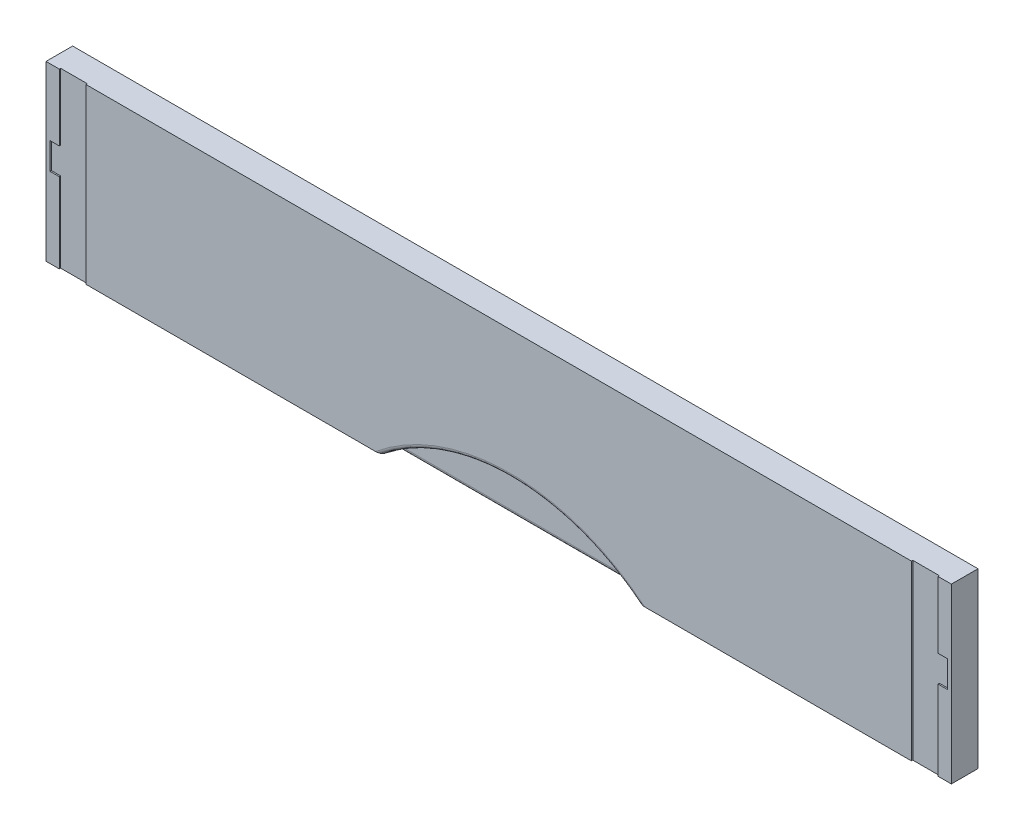
ISO-10303-21;
HEADER;
FILE_DESCRIPTION(('STEP AP214'),'2;1');
FILE_NAME('part.step','',(''),(''),'','','');
FILE_SCHEMA(('AUTOMOTIVE_DESIGN { 1 0 10303 214 1 1 1 1 }'));
ENDSEC;
DATA;
#1=APPLICATION_CONTEXT('core data for automotive mechanical design processes');
#2=APPLICATION_PROTOCOL_DEFINITION('international standard','automotive_design',2000,#1);
#3=PRODUCT_CONTEXT('',#1,'mechanical');
#4=PRODUCT('Part','Part','',(#3));
#5=PRODUCT_RELATED_PRODUCT_CATEGORY('part','',(#4));
#6=PRODUCT_DEFINITION_FORMATION('','',#4);
#7=PRODUCT_DEFINITION_CONTEXT('part definition',#1,'design');
#8=PRODUCT_DEFINITION('design','',#6,#7);
#9=PRODUCT_DEFINITION_SHAPE('','',#8);
#10=(LENGTH_UNIT() NAMED_UNIT(*) SI_UNIT(.MILLI.,.METRE.));
#11=(NAMED_UNIT(*) PLANE_ANGLE_UNIT() SI_UNIT($,.RADIAN.));
#12=(NAMED_UNIT(*) SI_UNIT($,.STERADIAN.) SOLID_ANGLE_UNIT());
#13=UNCERTAINTY_MEASURE_WITH_UNIT(LENGTH_MEASURE(1.E-05),#10,'distance_accuracy_value','');
#14=(GEOMETRIC_REPRESENTATION_CONTEXT(3) GLOBAL_UNCERTAINTY_ASSIGNED_CONTEXT((#13)) GLOBAL_UNIT_ASSIGNED_CONTEXT((#10,
#11,#12)) REPRESENTATION_CONTEXT('',''));
#15=CARTESIAN_POINT('',(0.,0.,0.));
#16=DIRECTION('',(0.,0.,1.));
#17=DIRECTION('',(1.,0.,0.));
#18=AXIS2_PLACEMENT_3D('',#15,#16,#17);
#19=CARTESIAN_POINT('',(0.,0.,20.));
#20=DIRECTION('',(0.,0.,-1.));
#21=DIRECTION('',(-1.,0.,0.));
#22=AXIS2_PLACEMENT_3D('',#19,#20,#21);
#23=PLANE('',#22);
#24=DIRECTION('',(-1.,0.,0.));
#25=VECTOR('',#24,1.);
#26=CARTESIAN_POINT('',(-340.,65.,20.));
#27=LINE('',#26,#25);
#28=CARTESIAN_POINT('',(310.,65.,20.));
#29=VERTEX_POINT('',#28);
#30=CARTESIAN_POINT('',(-310.,65.,20.));
#31=VERTEX_POINT('',#30);
#32=EDGE_CURVE('E310',#29,#31,#27,.T.);
#33=ORIENTED_EDGE('',*,*,#32,.T.);
#34=DIRECTION('',(0.,1.,0.));
#35=VECTOR('',#34,1.);
#36=CARTESIAN_POINT('',(-310.,65.,20.));
#37=LINE('',#36,#35);
#38=CARTESIAN_POINT('',(-310.,-65.,20.));
#39=VERTEX_POINT('',#38);
#40=EDGE_CURVE('E221',#39,#31,#37,.T.);
#41=ORIENTED_EDGE('',*,*,#40,.F.);
#42=DIRECTION('',(1.,0.,0.));
#43=VECTOR('',#42,1.);
#44=CARTESIAN_POINT('',(-340.,-65.,20.));
#45=LINE('',#44,#43);
#46=CARTESIAN_POINT('',(-92.4592539622144,-65.,20.));
#47=VERTEX_POINT('',#46);
#48=EDGE_CURVE('E317',#39,#47,#45,.T.);
#49=ORIENTED_EDGE('',*,*,#48,.T.);
#50=CARTESIAN_POINT('',(8.63075935572433,-187.032244742536,20.));
#51=DIRECTION('',(0.,0.,-1.));
#52=DIRECTION('',(-1.,0.,0.));
#53=AXIS2_PLACEMENT_3D('',#50,#51,#52);
#54=CIRCLE('',#53,158.46469496239);
#55=CARTESIAN_POINT('',(109.720772673663,-65.,20.));
#56=VERTEX_POINT('',#55);
#57=EDGE_CURVE('E455',#47,#56,#54,.T.);
#58=ORIENTED_EDGE('',*,*,#57,.T.);
#59=CARTESIAN_POINT('',(310.,-65.,20.));
#60=VERTEX_POINT('',#59);
#61=EDGE_CURVE('E318',#56,#60,#45,.T.);
#62=ORIENTED_EDGE('',*,*,#61,.T.);
#63=DIRECTION('',(0.,-1.,0.));
#64=VECTOR('',#63,1.);
#65=CARTESIAN_POINT('',(310.,65.,20.));
#66=LINE('',#65,#64);
#67=EDGE_CURVE('E259',#29,#60,#66,.T.);
#68=ORIENTED_EDGE('',*,*,#67,.F.);
#69=EDGE_LOOP('',(#33,#41,#49,#58,#62,#68));
#70=FACE_BOUND('',#69,.T.);
#71=ADVANCED_FACE('F39',(#70),#23,.F.);
#72=CARTESIAN_POINT('',(340.,65.,20.));
#73=VERTEX_POINT('',#72);
#74=CARTESIAN_POINT('',(330.,65.,20.));
#75=VERTEX_POINT('',#74);
#76=EDGE_CURVE('E306',#73,#75,#27,.T.);
#77=ORIENTED_EDGE('',*,*,#76,.T.);
#78=DIRECTION('',(0.,1.,0.));
#79=VECTOR('',#78,1.);
#80=CARTESIAN_POINT('',(330.,15.,20.));
#81=LINE('',#80,#79);
#82=CARTESIAN_POINT('',(330.,15.,20.));
#83=VERTEX_POINT('',#82);
#84=EDGE_CURVE('E238',#83,#75,#81,.T.);
#85=ORIENTED_EDGE('',*,*,#84,.F.);
#86=DIRECTION('',(-1.,0.,0.));
#87=VECTOR('',#86,1.);
#88=CARTESIAN_POINT('',(337.,15.,20.));
#89=LINE('',#88,#87);
#90=CARTESIAN_POINT('',(337.,15.,20.));
#91=VERTEX_POINT('',#90);
#92=EDGE_CURVE('E271',#91,#83,#89,.T.);
#93=ORIENTED_EDGE('',*,*,#92,.F.);
#94=DIRECTION('',(0.,1.,0.));
#95=VECTOR('',#94,1.);
#96=CARTESIAN_POINT('',(337.,-5.,20.));
#97=LINE('',#96,#95);
#98=CARTESIAN_POINT('',(337.,-5.,20.));
#99=VERTEX_POINT('',#98);
#100=EDGE_CURVE('E268',#99,#91,#97,.T.);
#101=ORIENTED_EDGE('',*,*,#100,.F.);
#102=DIRECTION('',(1.,0.,0.));
#103=VECTOR('',#102,1.);
#104=CARTESIAN_POINT('',(330.,-5.,20.));
#105=LINE('',#104,#103);
#106=CARTESIAN_POINT('',(330.,-5.,20.));
#107=VERTEX_POINT('',#106);
#108=EDGE_CURVE('E265',#107,#99,#105,.T.);
#109=ORIENTED_EDGE('',*,*,#108,.F.);
#110=DIRECTION('',(0.,1.,0.));
#111=VECTOR('',#110,1.);
#112=CARTESIAN_POINT('',(330.,-65.,20.));
#113=LINE('',#112,#111);
#114=CARTESIAN_POINT('',(330.,-65.,20.));
#115=VERTEX_POINT('',#114);
#116=EDGE_CURVE('E261',#115,#107,#113,.T.);
#117=ORIENTED_EDGE('',*,*,#116,.F.);
#118=CARTESIAN_POINT('',(340.,-65.,20.));
#119=VERTEX_POINT('',#118);
#120=EDGE_CURVE('E312',#115,#119,#45,.T.);
#121=ORIENTED_EDGE('',*,*,#120,.T.);
#122=DIRECTION('',(0.,1.,0.));
#123=VECTOR('',#122,1.);
#124=CARTESIAN_POINT('',(340.,-65.,20.));
#125=LINE('',#124,#123);
#126=EDGE_CURVE('E302',#119,#73,#125,.T.);
#127=ORIENTED_EDGE('',*,*,#126,.T.);
#128=EDGE_LOOP('',(#77,#85,#93,#101,#109,#117,#121,#127));
#129=FACE_BOUND('',#128,.T.);
#130=ADVANCED_FACE('F373',(#129),#23,.F.);
#131=CARTESIAN_POINT('',(340.,-65.,20.));
#132=DIRECTION('',(-1.,0.,0.));
#133=DIRECTION('',(0.,0.,1.));
#134=AXIS2_PLACEMENT_3D('',#131,#132,#133);
#135=PLANE('',#134);
#136=DIRECTION('',(0.,1.,0.));
#137=VECTOR('',#136,1.);
#138=CARTESIAN_POINT('',(340.,-65.,0.));
#139=LINE('',#138,#137);
#140=CARTESIAN_POINT('',(340.,-65.,0.));
#141=VERTEX_POINT('',#140);
#142=CARTESIAN_POINT('',(340.,65.,0.));
#143=VERTEX_POINT('',#142);
#144=EDGE_CURVE('E299',#141,#143,#139,.T.);
#145=ORIENTED_EDGE('',*,*,#144,.T.);
#146=DIRECTION('',(0.,0.,-1.));
#147=VECTOR('',#146,1.);
#148=CARTESIAN_POINT('',(340.,65.,20.));
#149=LINE('',#148,#147);
#150=EDGE_CURVE('E334',#73,#143,#149,.T.);
#151=ORIENTED_EDGE('',*,*,#150,.F.);
#152=ORIENTED_EDGE('',*,*,#126,.F.);
#153=DIRECTION('',(0.,0.,-1.));
#154=VECTOR('',#153,1.);
#155=CARTESIAN_POINT('',(340.,-65.,20.));
#156=LINE('',#155,#154);
#157=EDGE_CURVE('E316',#119,#141,#156,.T.);
#158=ORIENTED_EDGE('',*,*,#157,.T.);
#159=EDGE_LOOP('',(#145,#151,#152,#158));
#160=FACE_BOUND('',#159,.T.);
#161=ADVANCED_FACE('F371',(#160),#135,.F.);
#162=CARTESIAN_POINT('',(-340.,65.,20.));
#163=DIRECTION('',(0.,-1.,0.));
#164=DIRECTION('',(0.,0.,-1.));
#165=AXIS2_PLACEMENT_3D('',#162,#163,#164);
#166=PLANE('',#165);
#167=DIRECTION('',(-1.,0.,0.));
#168=VECTOR('',#167,1.);
#169=CARTESIAN_POINT('',(-330.,65.,19.));
#170=LINE('',#169,#168);
#171=CARTESIAN_POINT('',(-310.,65.,19.));
#172=VERTEX_POINT('',#171);
#173=CARTESIAN_POINT('',(-330.,65.,19.));
#174=VERTEX_POINT('',#173);
#175=EDGE_CURVE('E212',#172,#174,#170,.T.);
#176=ORIENTED_EDGE('',*,*,#175,.F.);
#177=DIRECTION('',(0.,0.,1.));
#178=VECTOR('',#177,1.);
#179=CARTESIAN_POINT('',(-310.,65.,19.));
#180=LINE('',#179,#178);
#181=EDGE_CURVE('E262',#172,#31,#180,.T.);
#182=ORIENTED_EDGE('',*,*,#181,.T.);
#183=ORIENTED_EDGE('',*,*,#32,.F.);
#184=DIRECTION('',(0.,0.,1.));
#185=VECTOR('',#184,1.);
#186=CARTESIAN_POINT('',(310.,65.,19.));
#187=LINE('',#186,#185);
#188=CARTESIAN_POINT('',(310.,65.,19.));
#189=VERTEX_POINT('',#188);
#190=EDGE_CURVE('E68',#189,#29,#187,.T.);
#191=ORIENTED_EDGE('',*,*,#190,.F.);
#192=DIRECTION('',(-1.,0.,0.));
#193=VECTOR('',#192,1.);
#194=CARTESIAN_POINT('',(330.,65.,19.));
#195=LINE('',#194,#193);
#196=CARTESIAN_POINT('',(330.,65.,19.));
#197=VERTEX_POINT('',#196);
#198=EDGE_CURVE('E234',#197,#189,#195,.T.);
#199=ORIENTED_EDGE('',*,*,#198,.F.);
#200=DIRECTION('',(0.,0.,1.));
#201=VECTOR('',#200,1.);
#202=CARTESIAN_POINT('',(330.,65.,19.));
#203=LINE('',#202,#201);
#204=EDGE_CURVE('E275',#197,#75,#203,.T.);
#205=ORIENTED_EDGE('',*,*,#204,.T.);
#206=ORIENTED_EDGE('',*,*,#76,.F.);
#207=ORIENTED_EDGE('',*,*,#150,.T.);
#208=DIRECTION('',(-1.,0.,0.));
#209=VECTOR('',#208,1.);
#210=CARTESIAN_POINT('',(-340.,65.,0.));
#211=LINE('',#210,#209);
#212=CARTESIAN_POINT('',(-340.,65.,0.));
#213=VERTEX_POINT('',#212);
#214=EDGE_CURVE('E321',#143,#213,#211,.T.);
#215=ORIENTED_EDGE('',*,*,#214,.T.);
#216=DIRECTION('',(0.,0.,-1.));
#217=VECTOR('',#216,1.);
#218=CARTESIAN_POINT('',(-340.,65.,20.));
#219=LINE('',#218,#217);
#220=CARTESIAN_POINT('',(-340.,65.,20.));
#221=VERTEX_POINT('',#220);
#222=EDGE_CURVE('E331',#221,#213,#219,.T.);
#223=ORIENTED_EDGE('',*,*,#222,.F.);
#224=CARTESIAN_POINT('',(-330.,65.,20.));
#225=VERTEX_POINT('',#224);
#226=EDGE_CURVE('E226',#225,#221,#27,.T.);
#227=ORIENTED_EDGE('',*,*,#226,.F.);
#228=DIRECTION('',(0.,0.,1.));
#229=VECTOR('',#228,1.);
#230=CARTESIAN_POINT('',(-330.,65.,19.));
#231=LINE('',#230,#229);
#232=EDGE_CURVE('E60',#174,#225,#231,.T.);
#233=ORIENTED_EDGE('',*,*,#232,.F.);
#234=EDGE_LOOP('',(#176,#182,#183,#191,#199,#205,#206,#207,#215,#223,#227,#233));
#235=FACE_BOUND('',#234,.T.);
#236=ADVANCED_FACE('F224',(#235),#166,.F.);
#237=CARTESIAN_POINT('',(-340.,-65.,20.));
#238=DIRECTION('',(1.,0.,0.));
#239=DIRECTION('',(0.,0.,-1.));
#240=AXIS2_PLACEMENT_3D('',#237,#238,#239);
#241=PLANE('',#240);
#242=DIRECTION('',(0.,-1.,0.));
#243=VECTOR('',#242,1.);
#244=CARTESIAN_POINT('',(-340.,-65.,0.));
#245=LINE('',#244,#243);
#246=CARTESIAN_POINT('',(-340.,-65.,0.));
#247=VERTEX_POINT('',#246);
#248=EDGE_CURVE('E323',#213,#247,#245,.T.);
#249=ORIENTED_EDGE('',*,*,#248,.T.);
#250=DIRECTION('',(0.,0.,-1.));
#251=VECTOR('',#250,1.);
#252=CARTESIAN_POINT('',(-340.,-65.,20.));
#253=LINE('',#252,#251);
#254=CARTESIAN_POINT('',(-340.,-65.,20.));
#255=VERTEX_POINT('',#254);
#256=EDGE_CURVE('E328',#255,#247,#253,.T.);
#257=ORIENTED_EDGE('',*,*,#256,.F.);
#258=DIRECTION('',(0.,-1.,0.));
#259=VECTOR('',#258,1.);
#260=CARTESIAN_POINT('',(-340.,-65.,20.));
#261=LINE('',#260,#259);
#262=EDGE_CURVE('E309',#221,#255,#261,.T.);
#263=ORIENTED_EDGE('',*,*,#262,.F.);
#264=ORIENTED_EDGE('',*,*,#222,.T.);
#265=EDGE_LOOP('',(#249,#257,#263,#264));
#266=FACE_BOUND('',#265,.T.);
#267=ADVANCED_FACE('F362',(#266),#241,.F.);
#268=CARTESIAN_POINT('',(-340.,-65.,20.));
#269=DIRECTION('',(0.,1.,0.));
#270=DIRECTION('',(0.,0.,1.));
#271=AXIS2_PLACEMENT_3D('',#268,#269,#270);
#272=PLANE('',#271);
#273=ORIENTED_EDGE('',*,*,#48,.F.);
#274=DIRECTION('',(0.,0.,1.));
#275=VECTOR('',#274,1.);
#276=CARTESIAN_POINT('',(-310.,-65.,19.));
#277=LINE('',#276,#275);
#278=CARTESIAN_POINT('',(-310.,-65.,19.));
#279=VERTEX_POINT('',#278);
#280=EDGE_CURVE('E409',#279,#39,#277,.T.);
#281=ORIENTED_EDGE('',*,*,#280,.F.);
#282=DIRECTION('',(1.,0.,0.));
#283=VECTOR('',#282,1.);
#284=CARTESIAN_POINT('',(-310.,-65.,19.));
#285=LINE('',#284,#283);
#286=CARTESIAN_POINT('',(-330.,-65.,19.));
#287=VERTEX_POINT('',#286);
#288=EDGE_CURVE('E230',#287,#279,#285,.T.);
#289=ORIENTED_EDGE('',*,*,#288,.F.);
#290=DIRECTION('',(0.,0.,1.));
#291=VECTOR('',#290,1.);
#292=CARTESIAN_POINT('',(-330.,-65.,19.));
#293=LINE('',#292,#291);
#294=CARTESIAN_POINT('',(-330.,-65.,20.));
#295=VERTEX_POINT('',#294);
#296=EDGE_CURVE('E404',#287,#295,#293,.T.);
#297=ORIENTED_EDGE('',*,*,#296,.T.);
#298=EDGE_CURVE('E313',#255,#295,#45,.T.);
#299=ORIENTED_EDGE('',*,*,#298,.F.);
#300=ORIENTED_EDGE('',*,*,#256,.T.);
#301=DIRECTION('',(1.,0.,0.));
#302=VECTOR('',#301,1.);
#303=CARTESIAN_POINT('',(-340.,-65.,0.));
#304=LINE('',#303,#302);
#305=EDGE_CURVE('E305',#247,#141,#304,.T.);
#306=ORIENTED_EDGE('',*,*,#305,.T.);
#307=ORIENTED_EDGE('',*,*,#157,.F.);
#308=ORIENTED_EDGE('',*,*,#120,.F.);
#309=DIRECTION('',(0.,0.,1.));
#310=VECTOR('',#309,1.);
#311=CARTESIAN_POINT('',(330.,-65.,19.));
#312=LINE('',#311,#310);
#313=CARTESIAN_POINT('',(330.,-65.,19.));
#314=VERTEX_POINT('',#313);
#315=EDGE_CURVE('E287',#314,#115,#312,.T.);
#316=ORIENTED_EDGE('',*,*,#315,.F.);
#317=DIRECTION('',(1.,0.,0.));
#318=VECTOR('',#317,1.);
#319=CARTESIAN_POINT('',(310.,-65.,19.));
#320=LINE('',#319,#318);
#321=CARTESIAN_POINT('',(310.,-65.,19.));
#322=VERTEX_POINT('',#321);
#323=EDGE_CURVE('E241',#322,#314,#320,.T.);
#324=ORIENTED_EDGE('',*,*,#323,.F.);
#325=DIRECTION('',(0.,0.,1.));
#326=VECTOR('',#325,1.);
#327=CARTESIAN_POINT('',(310.,-65.,19.));
#328=LINE('',#327,#326);
#329=EDGE_CURVE('E289',#322,#60,#328,.T.);
#330=ORIENTED_EDGE('',*,*,#329,.T.);
#331=ORIENTED_EDGE('',*,*,#61,.F.);
#332=CARTESIAN_POINT('',(109.720772673663,-65.,20.));
#333=CARTESIAN_POINT('',(109.619638134241,-65.,19.9999959708007));
#334=CARTESIAN_POINT('',(109.518515268347,-65.,19.9979190582826));
#335=CARTESIAN_POINT('',(109.316436296389,-65.,19.9896115971215));
#336=CARTESIAN_POINT('',(109.21548019723,-65.,19.9833808806212));
#337=CARTESIAN_POINT('',(108.912709970433,-65.,19.9584151798617));
#338=CARTESIAN_POINT('',(108.7113757984,-65.,19.9334065713925));
#339=CARTESIAN_POINT('',(108.309234729398,-65.,19.8658891992966));
#340=CARTESIAN_POINT('',(108.108461385276,-65.,19.8231796792793));
#341=CARTESIAN_POINT('',(107.711913587767,-65.,19.7194308799956));
#342=CARTESIAN_POINT('',(107.516134139548,-65.,19.6584107627146));
#343=CARTESIAN_POINT('',(107.107259751486,-65.,19.5075603085166));
#344=CARTESIAN_POINT('',(106.895117625716,-65.,19.4150576722885));
#345=CARTESIAN_POINT('',(106.588141525679,-65.,19.2554694898936));
#346=CARTESIAN_POINT('',(106.48779717791,-65.,19.1988775032565));
#347=CARTESIAN_POINT('',(106.291696330802,-65.,19.0782582487996));
#348=CARTESIAN_POINT('',(106.195938560601,-65.,19.0142330576274));
#349=CARTESIAN_POINT('',(105.966448261059,-65.,18.8462358311108));
#350=CARTESIAN_POINT('',(105.836029844684,-65.,18.7376355839505));
#351=CARTESIAN_POINT('',(105.593100872655,-65.,18.5018060040853));
#352=CARTESIAN_POINT('',(105.480567975577,-65.,18.3746002998542));
#353=CARTESIAN_POINT('',(105.308010382867,-65.,18.1379475252494));
#354=CARTESIAN_POINT('',(105.241998823797,-65.,18.032895385284));
#355=CARTESIAN_POINT('',(105.12777728567,-65.,17.8137075588186));
#356=CARTESIAN_POINT('',(105.07951528055,-65.,17.6995996308519));
#357=CARTESIAN_POINT('',(105.012134945688,-65.,17.4883787774659));
#358=CARTESIAN_POINT('',(104.98908483487,-65.,17.3925318477876));
#359=CARTESIAN_POINT('',(104.965780234847,-65.,17.246695228132));
#360=CARTESIAN_POINT('',(104.95988985444,-65.,17.1975649917819));
#361=CARTESIAN_POINT('',(104.952011528759,-65.,17.0989630794299));
#362=CARTESIAN_POINT('',(104.950025973868,-65.,17.0494912128767));
#363=CARTESIAN_POINT('',(104.950033765609,-65.,17.));
#364=B_SPLINE_CURVE_WITH_KNOTS('',3,(#332,#333,#334,#335,#336,#337,#338,#339,#340,#341,#342,
#343,#344,#345,#346,#347,#348,#349,#350,#351,#352,#353,#354,#355,#356,#357,#358,#359,#360,#361,
#362,#363),.UNSPECIFIED.,.F.,.F.,(4,2,2,2,2,2,2,2,2,2,2,2,2,2,2,4),(0.,0.303358922625846,
0.606730104884305,1.21461461690777,1.82959082251887,2.44392568858284,3.13617017365452,
3.48150482345366,3.82674322668199,4.33430574583517,4.84122918161469,5.21211812849285,
5.58191112393388,5.87646364463283,6.02477005732852,6.17316722921338),.UNSPECIFIED.);
#365=CARTESIAN_POINT('',(104.950033765609,-65.,17.));
#366=VERTEX_POINT('',#365);
#367=EDGE_CURVE('E340',#56,#366,#364,.T.);
#368=ORIENTED_EDGE('',*,*,#367,.T.);
#369=DIRECTION('',(0.,0.,1.));
#370=VECTOR('',#369,1.);
#371=CARTESIAN_POINT('',(104.950033765609,-65.,10.));
#372=LINE('',#371,#370);
#373=CARTESIAN_POINT('',(104.950033765609,-65.,7.));
#374=VERTEX_POINT('',#373);
#375=EDGE_CURVE('E296',#374,#366,#372,.T.);
#376=ORIENTED_EDGE('',*,*,#375,.F.);
#377=DIRECTION('',(1.,0.,0.));
#378=VECTOR('',#377,1.);
#379=CARTESIAN_POINT('',(-340.,-65.,7.));
#380=LINE('',#379,#378);
#381=CARTESIAN_POINT('',(-87.6885150541605,-65.,7.));
#382=VERTEX_POINT('',#381);
#383=EDGE_CURVE('E463',#374,#382,#380,.F.);
#384=ORIENTED_EDGE('',*,*,#383,.T.);
#385=DIRECTION('',(0.,0.,1.));
#386=VECTOR('',#385,1.);
#387=CARTESIAN_POINT('',(-87.6885150541605,-65.,10.));
#388=LINE('',#387,#386);
#389=CARTESIAN_POINT('',(-87.6885150541605,-65.,17.));
#390=VERTEX_POINT('',#389);
#391=EDGE_CURVE('E295',#382,#390,#388,.T.);
#392=ORIENTED_EDGE('',*,*,#391,.T.);
#393=CARTESIAN_POINT('',(-87.6885150541605,-65.,17.));
#394=CARTESIAN_POINT('',(-87.6884844117382,-65.,17.0628249356231));
#395=CARTESIAN_POINT('',(-87.6916992178091,-65.,17.1256319440818));
#396=CARTESIAN_POINT('',(-87.7043820860586,-65.,17.2505392065817));
#397=CARTESIAN_POINT('',(-87.7138427564497,-65.,17.3126402078961));
#398=CARTESIAN_POINT('',(-87.7386403955711,-65.,17.4349237591783));
#399=CARTESIAN_POINT('',(-87.7539100274891,-65.,17.4951200347252));
#400=CARTESIAN_POINT('',(-87.7899267769053,-65.,17.6138434832272));
#401=CARTESIAN_POINT('',(-87.8106751562964,-65.,17.6723702682113));
#402=CARTESIAN_POINT('',(-87.8802372272725,-65.,17.8443157283925));
#403=CARTESIAN_POINT('',(-87.9365133440942,-65.,17.9547774116762));
#404=CARTESIAN_POINT('',(-88.0650982942289,-65.,18.1661093925223));
#405=CARTESIAN_POINT('',(-88.1374563720272,-65.,18.2669488402901));
#406=CARTESIAN_POINT('',(-88.3362743407604,-65.,18.5093520356467));
#407=CARTESIAN_POINT('',(-88.4710512161567,-65.,18.6440815746217));
#408=CARTESIAN_POINT('',(-88.7598247928013,-65.,18.8909533858158));
#409=CARTESIAN_POINT('',(-88.9138619955443,-65.,19.0030467188241));
#410=CARTESIAN_POINT('',(-89.1985921596224,-65.,19.1837561861652));
#411=CARTESIAN_POINT('',(-89.3267314500619,-65.,19.2564787517818));
#412=CARTESIAN_POINT('',(-89.5888627277951,-65.,19.3906076030983));
#413=CARTESIAN_POINT('',(-89.7228579459494,-65.,19.4520075417819));
#414=CARTESIAN_POINT('',(-89.995474226501,-65.,19.56436972851));
#415=CARTESIAN_POINT('',(-90.1341050715203,-65.,19.6153080401585));
#416=CARTESIAN_POINT('',(-90.414636840789,-65.,19.707221564713));
#417=CARTESIAN_POINT('',(-90.5565382924145,-65.,19.7481951583565));
#418=CARTESIAN_POINT('',(-90.843883994077,-65.,19.8209430961548));
#419=CARTESIAN_POINT('',(-90.9893475763524,-65.,19.8526406662289));
#420=CARTESIAN_POINT('',(-91.2820004377861,-65.,19.906739991672));
#421=CARTESIAN_POINT('',(-91.4291898945046,-65.,19.9291407817925));
#422=CARTESIAN_POINT('',(-91.7232955486323,-65.,19.9646992073143));
#423=CARTESIAN_POINT('',(-91.8702017015331,-65.,19.9779403468319));
#424=CARTESIAN_POINT('',(-92.1644916758713,-65.,19.9955793301502));
#425=CARTESIAN_POINT('',(-92.3118753054287,-65.,19.9999803691405));
#426=CARTESIAN_POINT('',(-92.4592539622144,-65.,20.));
#427=B_SPLINE_CURVE_WITH_KNOTS('',3,(#393,#394,#395,#396,#397,#398,#399,#400,#401,#402,#403,
#404,#405,#406,#407,#408,#409,#410,#411,#412,#413,#414,#415,#416,#417,#418,#419,#420,#421,#422,
#423,#424,#425,#426),.UNSPECIFIED.,.F.,.F.,(4,2,2,2,2,2,2,2,2,2,2,2,2,2,2,2,4),(0.,
0.1883636869242,0.376504849896311,0.56252846418654,0.748594961808088,1.11867753890037,
1.48990935123774,2.05841071650971,2.6281283176673,3.06956047692298,3.51123933832641,
3.9539177792763,4.39666810729048,4.84298549132054,5.28934920316052,5.73158801418792,
6.17366695245505),.UNSPECIFIED.);
#428=EDGE_CURVE('E347',#390,#47,#427,.T.);
#429=ORIENTED_EDGE('',*,*,#428,.T.);
#430=EDGE_LOOP('',(#273,#281,#289,#297,#299,#300,#306,#307,#308,#316,#324,#330,#331,#368,#376,
#384,#392,#429));
#431=FACE_BOUND('',#430,.T.);
#432=ADVANCED_FACE('F356',(#431),#272,.F.);
#433=ORIENTED_EDGE('',*,*,#298,.T.);
#434=DIRECTION('',(0.,-1.,0.));
#435=VECTOR('',#434,1.);
#436=CARTESIAN_POINT('',(-330.,-65.,20.));
#437=LINE('',#436,#435);
#438=CARTESIAN_POINT('',(-330.,-5.,20.));
#439=VERTEX_POINT('',#438);
#440=EDGE_CURVE('E397',#439,#295,#437,.T.);
#441=ORIENTED_EDGE('',*,*,#440,.F.);
#442=DIRECTION('',(1.,0.,0.));
#443=VECTOR('',#442,1.);
#444=CARTESIAN_POINT('',(-330.,-5.,20.));
#445=LINE('',#444,#443);
#446=CARTESIAN_POINT('',(-337.,-5.,20.));
#447=VERTEX_POINT('',#446);
#448=EDGE_CURVE('E433',#447,#439,#445,.T.);
#449=ORIENTED_EDGE('',*,*,#448,.F.);
#450=DIRECTION('',(0.,-1.,0.));
#451=VECTOR('',#450,1.);
#452=CARTESIAN_POINT('',(-337.,-5.,20.));
#453=LINE('',#452,#451);
#454=CARTESIAN_POINT('',(-337.,15.,20.));
#455=VERTEX_POINT('',#454);
#456=EDGE_CURVE('E423',#455,#447,#453,.T.);
#457=ORIENTED_EDGE('',*,*,#456,.F.);
#458=DIRECTION('',(-1.,0.,0.));
#459=VECTOR('',#458,1.);
#460=CARTESIAN_POINT('',(-337.,15.,20.));
#461=LINE('',#460,#459);
#462=CARTESIAN_POINT('',(-330.,15.,20.));
#463=VERTEX_POINT('',#462);
#464=EDGE_CURVE('E428',#463,#455,#461,.T.);
#465=ORIENTED_EDGE('',*,*,#464,.F.);
#466=DIRECTION('',(0.,-1.,0.));
#467=VECTOR('',#466,1.);
#468=CARTESIAN_POINT('',(-330.,15.,20.));
#469=LINE('',#468,#467);
#470=EDGE_CURVE('E430',#225,#463,#469,.T.);
#471=ORIENTED_EDGE('',*,*,#470,.F.);
#472=ORIENTED_EDGE('',*,*,#226,.T.);
#473=ORIENTED_EDGE('',*,*,#262,.T.);
#474=EDGE_LOOP('',(#433,#441,#449,#457,#465,#471,#472,#473));
#475=FACE_BOUND('',#474,.T.);
#476=ADVANCED_FACE('F361',(#475),#23,.F.);
#477=CARTESIAN_POINT('',(0.,0.,0.));
#478=DIRECTION('',(0.,0.,-1.));
#479=DIRECTION('',(-1.,0.,0.));
#480=AXIS2_PLACEMENT_3D('',#477,#478,#479);
#481=PLANE('',#480);
#482=ORIENTED_EDGE('',*,*,#144,.F.);
#483=ORIENTED_EDGE('',*,*,#305,.F.);
#484=ORIENTED_EDGE('',*,*,#248,.F.);
#485=ORIENTED_EDGE('',*,*,#214,.F.);
#486=EDGE_LOOP('',(#482,#483,#484,#485));
#487=FACE_BOUND('',#486,.T.);
#488=ADVANCED_FACE('F364',(#487),#481,.T.);
#489=CARTESIAN_POINT('',(8.63075935572433,-187.032244742536,10.));
#490=DIRECTION('',(0.,0.,1.));
#491=DIRECTION('',(1.,0.,0.));
#492=AXIS2_PLACEMENT_3D('',#489,#490,#491);
#493=CYLINDRICAL_SURFACE('',#492,155.46469496239);
#494=ORIENTED_EDGE('',*,*,#375,.T.);
#495=CARTESIAN_POINT('',(8.63075935572433,-187.032244742536,17.));
#496=DIRECTION('',(0.,0.,-1.));
#497=DIRECTION('',(-1.,0.,0.));
#498=AXIS2_PLACEMENT_3D('',#495,#496,#497);
#499=CIRCLE('',#498,155.46469496239);
#500=EDGE_CURVE('E337',#366,#390,#499,.F.);
#501=ORIENTED_EDGE('',*,*,#500,.T.);
#502=ORIENTED_EDGE('',*,*,#391,.F.);
#503=CARTESIAN_POINT('',(-87.6885150541605,-65.,7.));
#504=CARTESIAN_POINT('',(-87.6885377492077,-65.0000184025314,7.06248275088333));
#505=CARTESIAN_POINT('',(-87.6860427539178,-64.9980486378166,7.12494859632605));
#506=CARTESIAN_POINT('',(-87.6761932518922,-64.9902751987942,7.2491873406659));
#507=CARTESIAN_POINT('',(-87.6688441976898,-64.9844758262624,7.31096093807324));
#508=CARTESIAN_POINT('',(-87.6495676949184,-64.9692686110625,7.43262998904004));
#509=CARTESIAN_POINT('',(-87.6376911863579,-64.9599009177191,7.49253859318404));
#510=CARTESIAN_POINT('',(-87.6096579016421,-64.9377985700496,7.61070242968628));
#511=CARTESIAN_POINT('',(-87.5935002035311,-64.9250631904921,7.66895730291764));
#512=CARTESIAN_POINT('',(-87.5392771240474,-64.8823467863989,7.84013802388565));
#513=CARTESIAN_POINT('',(-87.4953538580203,-64.8477702207505,7.95012526503239));
#514=CARTESIAN_POINT('',(-87.3948298915029,-64.7687518758065,8.1604860134207));
#515=CARTESIAN_POINT('',(-87.3381916158871,-64.7242808601915,8.26082974077377));
#516=CARTESIAN_POINT('',(-87.1834093609685,-64.6029575661124,8.50024661945695));
#517=CARTESIAN_POINT('',(-87.0788966619502,-64.5212116640458,8.63271009529993));
#518=CARTESIAN_POINT('',(-86.8547116901646,-64.346399972885,8.87533170683207));
#519=CARTESIAN_POINT('',(-86.7350094568234,-64.2533118266477,8.98544460984967));
#520=CARTESIAN_POINT('',(-86.5122373660462,-64.0806405041978,9.16398551992752));
#521=CARTESIAN_POINT('',(-86.4111234888028,-64.0024557733354,9.23628602102654));
#522=CARTESIAN_POINT('',(-86.2040831651291,-63.8427926205634,9.36958683868454));
#523=CARTESIAN_POINT('',(-86.0981539362458,-63.761312297439,9.43058051576041));
#524=CARTESIAN_POINT('',(-85.8823902346564,-63.5958056819076,9.54232195111697));
#525=CARTESIAN_POINT('',(-85.7725449735206,-63.5117724685203,9.59303833808909));
#526=CARTESIAN_POINT('',(-85.5500955456616,-63.3420772651932,9.68479660602647));
#527=CARTESIAN_POINT('',(-85.4374907887401,-63.256414927711,9.72583639707944));
#528=CARTESIAN_POINT('',(-85.1962590487487,-63.073430470597,9.80335458365995));
#529=CARTESIAN_POINT('',(-85.0673616375969,-62.9759675297317,9.83865517572113));
#530=CARTESIAN_POINT('',(-84.8076666382504,-62.7802492363698,9.8985656383395));
#531=CARTESIAN_POINT('',(-84.6768685513192,-62.6819936790136,9.92317264857585));
#532=CARTESIAN_POINT('',(-84.4155415653489,-62.4863352618373,9.96197888831243));
#533=CARTESIAN_POINT('',(-84.2850274732884,-62.3889359023695,9.97629670171272));
#534=CARTESIAN_POINT('',(-84.0233373841772,-62.1942840832369,9.99529056787797));
#535=CARTESIAN_POINT('',(-83.8921619499215,-62.0970315681975,9.99997376475619));
#536=CARTESIAN_POINT('',(-83.7608482414567,-62.,10.));
#537=B_SPLINE_CURVE_WITH_KNOTS('',3,(#503,#504,#505,#506,#507,#508,#509,#510,#511,#512,#513,
#514,#515,#516,#517,#518,#519,#520,#521,#522,#523,#524,#525,#526,#527,#528,#529,#530,#531,#532,
#533,#534,#535,#536),.UNSPECIFIED.,.F.,.F.,(4,2,2,2,2,2,2,2,2,2,2,2,2,2,2,2,4),(0.,
0.187340146278075,0.374470211644229,0.559554147607971,0.74467797391076,1.11297447298413,
1.48237402606446,2.04168042552925,2.6021076944764,3.04206393010651,3.48227769981631,
3.92381562052258,4.36544881564315,4.86127807797914,5.3572398832909,5.84738978864368,
6.3371761143565),.UNSPECIFIED.);
#538=CARTESIAN_POINT('',(-83.7608482414567,-62.,10.));
#539=VERTEX_POINT('',#538);
#540=EDGE_CURVE('E11',#382,#539,#537,.T.);
#541=ORIENTED_EDGE('',*,*,#540,.T.);
#542=CARTESIAN_POINT('',(8.63075935572433,-187.032244742536,10.));
#543=DIRECTION('',(0.,0.,1.));
#544=DIRECTION('',(-1.,0.,0.));
#545=AXIS2_PLACEMENT_3D('',#542,#543,#544);
#546=CIRCLE('',#545,155.46469496239);
#547=CARTESIAN_POINT('',(101.022366952905,-62.,10.));
#548=VERTEX_POINT('',#547);
#549=EDGE_CURVE('E278',#548,#539,#546,.T.);
#550=ORIENTED_EDGE('',*,*,#549,.F.);
#551=CARTESIAN_POINT('',(101.022366952905,-62.,10.));
#552=CARTESIAN_POINT('',(101.11306186827,-62.067018144887,9.99999455077485));
#553=CARTESIAN_POINT('',(101.20367384401,-62.1341279488442,9.9977545961803));
#554=CARTESIAN_POINT('',(101.384618699041,-62.2684452971557,9.98872473509977));
#555=CARTESIAN_POINT('',(101.474951534076,-62.3356528547502,9.9819341409415));
#556=CARTESIAN_POINT('',(101.745909425306,-62.5377025773979,9.95455642575743));
#557=CARTESIAN_POINT('',(101.925899273233,-62.6725324035261,9.9269622545836));
#558=CARTESIAN_POINT('',(102.284909517767,-62.9426695671274,9.8515432602802));
#559=CARTESIAN_POINT('',(102.463888895908,-63.07796139455,9.80346710318663));
#560=CARTESIAN_POINT('',(102.816414108474,-63.345614119211,9.68527426055375));
#561=CARTESIAN_POINT('',(102.989968634538,-63.4779795936275,9.61519505340743));
#562=CARTESIAN_POINT('',(103.237365420495,-63.6674557431112,9.49490954153337));
#563=CARTESIAN_POINT('',(103.31443634365,-63.7266004799897,9.45441171257291));
#564=CARTESIAN_POINT('',(103.466496807271,-63.8435136746985,9.36785797325213));
#565=CARTESIAN_POINT('',(103.541486361729,-63.9012821417794,9.32180210026307));
#566=CARTESIAN_POINT('',(103.688744264593,-64.0149308665849,9.22388549375868));
#567=CARTESIAN_POINT('',(103.761018427791,-64.0708151293063,9.17203823542001));
#568=CARTESIAN_POINT('',(103.902408592984,-64.1803329132013,9.0620780032046));
#569=CARTESIAN_POINT('',(103.971525116946,-64.2339668062476,9.00396607027237));
#570=CARTESIAN_POINT('',(104.149041680631,-64.371947369569,8.84158435059968));
#571=CARTESIAN_POINT('',(104.254203601967,-64.4539282123314,8.73161607041529));
#572=CARTESIAN_POINT('',(104.4494948853,-64.6065259553415,8.49201601744155));
#573=CARTESIAN_POINT('',(104.539646403938,-64.6771595995109,8.36241377598623));
#574=CARTESIAN_POINT('',(104.675233032813,-64.783581668199,8.12400751353231));
#575=CARTESIAN_POINT('',(104.726043975996,-64.8235266871161,8.02014377238185));
#576=CARTESIAN_POINT('',(104.813830825271,-64.8926063509702,7.80354024770965));
#577=CARTESIAN_POINT('',(104.850845306212,-64.9217711354646,7.69082629553116));
#578=CARTESIAN_POINT('',(104.902501197222,-64.9624943314929,7.48220173339188));
#579=CARTESIAN_POINT('',(104.920155050391,-64.9764218763478,7.38750933451233));
#580=CARTESIAN_POINT('',(104.937991773379,-64.9904960811617,7.24349081273384));
#581=CARTESIAN_POINT('',(104.942497082921,-64.994051629761,7.19499281815805));
#582=CARTESIAN_POINT('',(104.948521693506,-64.9988065178699,7.09766949371044));
#583=CARTESIAN_POINT('',(104.950039283702,-65.0000045073791,7.0488439923456));
#584=CARTESIAN_POINT('',(104.950033765609,-65.,7.00000000000001));
#585=B_SPLINE_CURVE_WITH_KNOTS('',3,(#551,#552,#553,#554,#555,#556,#557,#558,#559,#560,#561,
#562,#563,#564,#565,#566,#567,#568,#569,#570,#571,#572,#573,#574,#575,#576,#577,#578,#579,#580,
#581,#582,#583,#584),.UNSPECIFIED.,.F.,.F.,(4,2,2,2,2,2,2,2,2,2,2,2,2,2,2,2,4),(0.,
0.338260610822654,0.676572349606209,1.35540723436237,2.0428235384943,2.72907524247958,
3.04469267415976,3.36030798380459,3.67520365497613,3.99004708318469,4.50683392292603,
5.02285104524736,5.38853998811445,5.7531986568178,6.04402770910902,6.19040249903451,
6.33686108264488),.UNSPECIFIED.);
#586=EDGE_CURVE('E53',#548,#374,#585,.T.);
#587=ORIENTED_EDGE('',*,*,#586,.T.);
#588=EDGE_LOOP('',(#494,#501,#502,#541,#550,#587));
#589=FACE_BOUND('',#588,.T.);
#590=ADVANCED_FACE('F392',(#589),#493,.F.);
#591=CARTESIAN_POINT('',(8.63075935572433,-187.032244742536,10.));
#592=DIRECTION('',(0.,0.,-1.));
#593=DIRECTION('',(-1.,0.,0.));
#594=AXIS2_PLACEMENT_3D('',#591,#592,#593);
#595=PLANE('',#594);
#596=ORIENTED_EDGE('',*,*,#549,.T.);
#597=DIRECTION('',(1.,0.,0.));
#598=VECTOR('',#597,1.);
#599=CARTESIAN_POINT('',(8.63075935572433,-62.,10.));
#600=LINE('',#599,#598);
#601=EDGE_CURVE('E461',#539,#548,#600,.T.);
#602=ORIENTED_EDGE('',*,*,#601,.T.);
#603=EDGE_LOOP('',(#596,#602));
#604=FACE_BOUND('',#603,.T.);
#605=ADVANCED_FACE('F474',(#604),#595,.F.);
#606=CARTESIAN_POINT('',(8.63075935572433,-187.032244742536,17.));
#607=DIRECTION('',(0.,0.,-1.));
#608=DIRECTION('',(-1.,0.,0.));
#609=AXIS2_PLACEMENT_3D('',#606,#607,#608);
#610=TOROIDAL_SURFACE('',#609,158.46469496239,3.);
#611=ORIENTED_EDGE('',*,*,#367,.F.);
#612=ORIENTED_EDGE('',*,*,#57,.F.);
#613=ORIENTED_EDGE('',*,*,#428,.F.);
#614=ORIENTED_EDGE('',*,*,#500,.F.);
#615=EDGE_LOOP('',(#611,#612,#613,#614));
#616=FACE_BOUND('',#615,.T.);
#617=ADVANCED_FACE('F353',(#616),#610,.T.);
#618=CARTESIAN_POINT('',(8.63075935572433,-62.,7.));
#619=DIRECTION('',(1.,0.,0.));
#620=DIRECTION('',(0.,0.,-1.));
#621=AXIS2_PLACEMENT_3D('',#618,#619,#620);
#622=CYLINDRICAL_SURFACE('',#621,3.);
#623=ORIENTED_EDGE('',*,*,#540,.F.);
#624=ORIENTED_EDGE('',*,*,#383,.F.);
#625=ORIENTED_EDGE('',*,*,#586,.F.);
#626=ORIENTED_EDGE('',*,*,#601,.F.);
#627=EDGE_LOOP('',(#623,#624,#625,#626));
#628=FACE_BOUND('',#627,.T.);
#629=ADVANCED_FACE('F41',(#628),#622,.T.);
#630=CARTESIAN_POINT('',(330.,15.,19.));
#631=DIRECTION('',(1.,0.,0.));
#632=DIRECTION('',(0.,0.,-1.));
#633=AXIS2_PLACEMENT_3D('',#630,#631,#632);
#634=PLANE('',#633);
#635=ORIENTED_EDGE('',*,*,#84,.T.);
#636=ORIENTED_EDGE('',*,*,#204,.F.);
#637=DIRECTION('',(0.,1.,0.));
#638=VECTOR('',#637,1.);
#639=CARTESIAN_POINT('',(330.,15.,19.));
#640=LINE('',#639,#638);
#641=CARTESIAN_POINT('',(330.,15.,19.));
#642=VERTEX_POINT('',#641);
#643=EDGE_CURVE('E256',#642,#197,#640,.T.);
#644=ORIENTED_EDGE('',*,*,#643,.F.);
#645=DIRECTION('',(0.,0.,1.));
#646=VECTOR('',#645,1.);
#647=CARTESIAN_POINT('',(330.,15.,19.));
#648=LINE('',#647,#646);
#649=EDGE_CURVE('E279',#642,#83,#648,.T.);
#650=ORIENTED_EDGE('',*,*,#649,.T.);
#651=EDGE_LOOP('',(#635,#636,#644,#650));
#652=FACE_BOUND('',#651,.T.);
#653=ADVANCED_FACE('F499',(#652),#634,.F.);
#654=CARTESIAN_POINT('',(337.,15.,19.));
#655=DIRECTION('',(0.,1.,0.));
#656=DIRECTION('',(0.,0.,1.));
#657=AXIS2_PLACEMENT_3D('',#654,#655,#656);
#658=PLANE('',#657);
#659=ORIENTED_EDGE('',*,*,#92,.T.);
#660=ORIENTED_EDGE('',*,*,#649,.F.);
#661=DIRECTION('',(-1.,0.,0.));
#662=VECTOR('',#661,1.);
#663=CARTESIAN_POINT('',(337.,15.,19.));
#664=LINE('',#663,#662);
#665=CARTESIAN_POINT('',(337.,15.,19.));
#666=VERTEX_POINT('',#665);
#667=EDGE_CURVE('E253',#666,#642,#664,.T.);
#668=ORIENTED_EDGE('',*,*,#667,.F.);
#669=DIRECTION('',(0.,0.,1.));
#670=VECTOR('',#669,1.);
#671=CARTESIAN_POINT('',(337.,15.,19.));
#672=LINE('',#671,#670);
#673=EDGE_CURVE('E281',#666,#91,#672,.T.);
#674=ORIENTED_EDGE('',*,*,#673,.T.);
#675=EDGE_LOOP('',(#659,#660,#668,#674));
#676=FACE_BOUND('',#675,.T.);
#677=ADVANCED_FACE('F495',(#676),#658,.F.);
#678=CARTESIAN_POINT('',(337.,-5.,19.));
#679=DIRECTION('',(1.,0.,0.));
#680=DIRECTION('',(0.,0.,-1.));
#681=AXIS2_PLACEMENT_3D('',#678,#679,#680);
#682=PLANE('',#681);
#683=ORIENTED_EDGE('',*,*,#100,.T.);
#684=ORIENTED_EDGE('',*,*,#673,.F.);
#685=DIRECTION('',(0.,1.,0.));
#686=VECTOR('',#685,1.);
#687=CARTESIAN_POINT('',(337.,-5.,19.));
#688=LINE('',#687,#686);
#689=CARTESIAN_POINT('',(337.,-5.,19.));
#690=VERTEX_POINT('',#689);
#691=EDGE_CURVE('E250',#690,#666,#688,.T.);
#692=ORIENTED_EDGE('',*,*,#691,.F.);
#693=DIRECTION('',(0.,0.,1.));
#694=VECTOR('',#693,1.);
#695=CARTESIAN_POINT('',(337.,-5.,19.));
#696=LINE('',#695,#694);
#697=EDGE_CURVE('E283',#690,#99,#696,.T.);
#698=ORIENTED_EDGE('',*,*,#697,.T.);
#699=EDGE_LOOP('',(#683,#684,#692,#698));
#700=FACE_BOUND('',#699,.T.);
#701=ADVANCED_FACE('F491',(#700),#682,.F.);
#702=CARTESIAN_POINT('',(330.,-5.,19.));
#703=DIRECTION('',(0.,-1.,0.));
#704=DIRECTION('',(0.,0.,-1.));
#705=AXIS2_PLACEMENT_3D('',#702,#703,#704);
#706=PLANE('',#705);
#707=ORIENTED_EDGE('',*,*,#108,.T.);
#708=ORIENTED_EDGE('',*,*,#697,.F.);
#709=DIRECTION('',(1.,0.,0.));
#710=VECTOR('',#709,1.);
#711=CARTESIAN_POINT('',(330.,-5.,19.));
#712=LINE('',#711,#710);
#713=CARTESIAN_POINT('',(330.,-5.,19.));
#714=VERTEX_POINT('',#713);
#715=EDGE_CURVE('E247',#714,#690,#712,.T.);
#716=ORIENTED_EDGE('',*,*,#715,.F.);
#717=DIRECTION('',(0.,0.,1.));
#718=VECTOR('',#717,1.);
#719=CARTESIAN_POINT('',(330.,-5.,19.));
#720=LINE('',#719,#718);
#721=EDGE_CURVE('E285',#714,#107,#720,.T.);
#722=ORIENTED_EDGE('',*,*,#721,.T.);
#723=EDGE_LOOP('',(#707,#708,#716,#722));
#724=FACE_BOUND('',#723,.T.);
#725=ADVANCED_FACE('F487',(#724),#706,.F.);
#726=CARTESIAN_POINT('',(330.,-65.,19.));
#727=DIRECTION('',(1.,0.,0.));
#728=DIRECTION('',(0.,0.,-1.));
#729=AXIS2_PLACEMENT_3D('',#726,#727,#728);
#730=PLANE('',#729);
#731=ORIENTED_EDGE('',*,*,#116,.T.);
#732=ORIENTED_EDGE('',*,*,#721,.F.);
#733=DIRECTION('',(0.,1.,0.));
#734=VECTOR('',#733,1.);
#735=CARTESIAN_POINT('',(330.,-65.,19.));
#736=LINE('',#735,#734);
#737=EDGE_CURVE('E244',#314,#714,#736,.T.);
#738=ORIENTED_EDGE('',*,*,#737,.F.);
#739=ORIENTED_EDGE('',*,*,#315,.T.);
#740=EDGE_LOOP('',(#731,#732,#738,#739));
#741=FACE_BOUND('',#740,.T.);
#742=ADVANCED_FACE('F484',(#741),#730,.F.);
#743=CARTESIAN_POINT('',(310.,65.,19.));
#744=DIRECTION('',(-1.,0.,0.));
#745=DIRECTION('',(0.,0.,1.));
#746=AXIS2_PLACEMENT_3D('',#743,#744,#745);
#747=PLANE('',#746);
#748=ORIENTED_EDGE('',*,*,#67,.T.);
#749=ORIENTED_EDGE('',*,*,#329,.F.);
#750=DIRECTION('',(0.,-1.,0.));
#751=VECTOR('',#750,1.);
#752=CARTESIAN_POINT('',(310.,65.,19.));
#753=LINE('',#752,#751);
#754=EDGE_CURVE('E237',#189,#322,#753,.T.);
#755=ORIENTED_EDGE('',*,*,#754,.F.);
#756=ORIENTED_EDGE('',*,*,#190,.T.);
#757=EDGE_LOOP('',(#748,#749,#755,#756));
#758=FACE_BOUND('',#757,.T.);
#759=ADVANCED_FACE('F480',(#758),#747,.F.);
#760=CARTESIAN_POINT('',(0.,0.,19.));
#761=DIRECTION('',(0.,0.,1.));
#762=DIRECTION('',(1.,0.,0.));
#763=AXIS2_PLACEMENT_3D('',#760,#761,#762);
#764=PLANE('',#763);
#765=ORIENTED_EDGE('',*,*,#198,.T.);
#766=ORIENTED_EDGE('',*,*,#754,.T.);
#767=ORIENTED_EDGE('',*,*,#323,.T.);
#768=ORIENTED_EDGE('',*,*,#737,.T.);
#769=ORIENTED_EDGE('',*,*,#715,.T.);
#770=ORIENTED_EDGE('',*,*,#691,.T.);
#771=ORIENTED_EDGE('',*,*,#667,.T.);
#772=ORIENTED_EDGE('',*,*,#643,.T.);
#773=EDGE_LOOP('',(#765,#766,#767,#768,#769,#770,#771,#772));
#774=FACE_BOUND('',#773,.T.);
#775=ADVANCED_FACE('F483',(#774),#764,.T.);
#776=CARTESIAN_POINT('',(-310.,65.,19.));
#777=DIRECTION('',(1.,0.,0.));
#778=DIRECTION('',(0.,0.,-1.));
#779=AXIS2_PLACEMENT_3D('',#776,#777,#778);
#780=PLANE('',#779);
#781=ORIENTED_EDGE('',*,*,#40,.T.);
#782=ORIENTED_EDGE('',*,*,#181,.F.);
#783=DIRECTION('',(0.,1.,0.));
#784=VECTOR('',#783,1.);
#785=CARTESIAN_POINT('',(-310.,65.,19.));
#786=LINE('',#785,#784);
#787=EDGE_CURVE('E218',#279,#172,#786,.T.);
#788=ORIENTED_EDGE('',*,*,#787,.F.);
#789=ORIENTED_EDGE('',*,*,#280,.T.);
#790=EDGE_LOOP('',(#781,#782,#788,#789));
#791=FACE_BOUND('',#790,.T.);
#792=ADVANCED_FACE('F506',(#791),#780,.F.);
#793=CARTESIAN_POINT('',(-330.,-65.,19.));
#794=DIRECTION('',(-1.,0.,0.));
#795=DIRECTION('',(0.,0.,1.));
#796=AXIS2_PLACEMENT_3D('',#793,#794,#795);
#797=PLANE('',#796);
#798=ORIENTED_EDGE('',*,*,#440,.T.);
#799=ORIENTED_EDGE('',*,*,#296,.F.);
#800=DIRECTION('',(0.,-1.,0.));
#801=VECTOR('',#800,1.);
#802=CARTESIAN_POINT('',(-330.,-65.,19.));
#803=LINE('',#802,#801);
#804=CARTESIAN_POINT('',(-330.,-5.,19.));
#805=VERTEX_POINT('',#804);
#806=EDGE_CURVE('E686',#805,#287,#803,.T.);
#807=ORIENTED_EDGE('',*,*,#806,.F.);
#808=DIRECTION('',(0.,0.,1.));
#809=VECTOR('',#808,1.);
#810=CARTESIAN_POINT('',(-330.,-5.,19.));
#811=LINE('',#810,#809);
#812=EDGE_CURVE('E410',#805,#439,#811,.T.);
#813=ORIENTED_EDGE('',*,*,#812,.T.);
#814=EDGE_LOOP('',(#798,#799,#807,#813));
#815=FACE_BOUND('',#814,.T.);
#816=ADVANCED_FACE('F517',(#815),#797,.F.);
#817=CARTESIAN_POINT('',(-330.,-5.,19.));
#818=DIRECTION('',(0.,-1.,0.));
#819=DIRECTION('',(0.,0.,-1.));
#820=AXIS2_PLACEMENT_3D('',#817,#818,#819);
#821=PLANE('',#820);
#822=ORIENTED_EDGE('',*,*,#448,.T.);
#823=ORIENTED_EDGE('',*,*,#812,.F.);
#824=DIRECTION('',(1.,0.,0.));
#825=VECTOR('',#824,1.);
#826=CARTESIAN_POINT('',(-330.,-5.,19.));
#827=LINE('',#826,#825);
#828=CARTESIAN_POINT('',(-337.,-5.,19.));
#829=VERTEX_POINT('',#828);
#830=EDGE_CURVE('E689',#829,#805,#827,.T.);
#831=ORIENTED_EDGE('',*,*,#830,.F.);
#832=DIRECTION('',(0.,0.,1.));
#833=VECTOR('',#832,1.);
#834=CARTESIAN_POINT('',(-337.,-5.,19.));
#835=LINE('',#834,#833);
#836=EDGE_CURVE('E413',#829,#447,#835,.T.);
#837=ORIENTED_EDGE('',*,*,#836,.T.);
#838=EDGE_LOOP('',(#822,#823,#831,#837));
#839=FACE_BOUND('',#838,.T.);
#840=ADVANCED_FACE('F514',(#839),#821,.F.);
#841=CARTESIAN_POINT('',(-337.,-5.,19.));
#842=DIRECTION('',(-1.,0.,0.));
#843=DIRECTION('',(0.,0.,1.));
#844=AXIS2_PLACEMENT_3D('',#841,#842,#843);
#845=PLANE('',#844);
#846=ORIENTED_EDGE('',*,*,#456,.T.);
#847=ORIENTED_EDGE('',*,*,#836,.F.);
#848=DIRECTION('',(0.,-1.,0.));
#849=VECTOR('',#848,1.);
#850=CARTESIAN_POINT('',(-337.,-5.,19.));
#851=LINE('',#850,#849);
#852=CARTESIAN_POINT('',(-337.,15.,19.));
#853=VERTEX_POINT('',#852);
#854=EDGE_CURVE('E425',#853,#829,#851,.T.);
#855=ORIENTED_EDGE('',*,*,#854,.F.);
#856=DIRECTION('',(0.,0.,1.));
#857=VECTOR('',#856,1.);
#858=CARTESIAN_POINT('',(-337.,15.,19.));
#859=LINE('',#858,#857);
#860=EDGE_CURVE('E228',#853,#455,#859,.T.);
#861=ORIENTED_EDGE('',*,*,#860,.T.);
#862=EDGE_LOOP('',(#846,#847,#855,#861));
#863=FACE_BOUND('',#862,.T.);
#864=ADVANCED_FACE('F421',(#863),#845,.F.);
#865=CARTESIAN_POINT('',(-337.,15.,19.));
#866=DIRECTION('',(0.,1.,0.));
#867=DIRECTION('',(0.,0.,1.));
#868=AXIS2_PLACEMENT_3D('',#865,#866,#867);
#869=PLANE('',#868);
#870=ORIENTED_EDGE('',*,*,#464,.T.);
#871=ORIENTED_EDGE('',*,*,#860,.F.);
#872=DIRECTION('',(-1.,0.,0.));
#873=VECTOR('',#872,1.);
#874=CARTESIAN_POINT('',(-337.,15.,19.));
#875=LINE('',#874,#873);
#876=CARTESIAN_POINT('',(-330.,15.,19.));
#877=VERTEX_POINT('',#876);
#878=EDGE_CURVE('E211',#877,#853,#875,.T.);
#879=ORIENTED_EDGE('',*,*,#878,.F.);
#880=DIRECTION('',(0.,0.,1.));
#881=VECTOR('',#880,1.);
#882=CARTESIAN_POINT('',(-330.,15.,19.));
#883=LINE('',#882,#881);
#884=EDGE_CURVE('E207',#877,#463,#883,.T.);
#885=ORIENTED_EDGE('',*,*,#884,.T.);
#886=EDGE_LOOP('',(#870,#871,#879,#885));
#887=FACE_BOUND('',#886,.T.);
#888=ADVANCED_FACE('F429',(#887),#869,.F.);
#889=CARTESIAN_POINT('',(-330.,15.,19.));
#890=DIRECTION('',(-1.,0.,0.));
#891=DIRECTION('',(0.,0.,1.));
#892=AXIS2_PLACEMENT_3D('',#889,#890,#891);
#893=PLANE('',#892);
#894=ORIENTED_EDGE('',*,*,#470,.T.);
#895=ORIENTED_EDGE('',*,*,#884,.F.);
#896=DIRECTION('',(0.,-1.,0.));
#897=VECTOR('',#896,1.);
#898=CARTESIAN_POINT('',(-330.,15.,19.));
#899=LINE('',#898,#897);
#900=EDGE_CURVE('E204',#174,#877,#899,.T.);
#901=ORIENTED_EDGE('',*,*,#900,.F.);
#902=ORIENTED_EDGE('',*,*,#232,.T.);
#903=EDGE_LOOP('',(#894,#895,#901,#902));
#904=FACE_BOUND('',#903,.T.);
#905=ADVANCED_FACE('F206',(#904),#893,.F.);
#906=CARTESIAN_POINT('',(0.,0.,19.));
#907=DIRECTION('',(0.,0.,-1.));
#908=DIRECTION('',(-1.,0.,0.));
#909=AXIS2_PLACEMENT_3D('',#906,#907,#908);
#910=PLANE('',#909);
#911=ORIENTED_EDGE('',*,*,#175,.T.);
#912=ORIENTED_EDGE('',*,*,#900,.T.);
#913=ORIENTED_EDGE('',*,*,#878,.T.);
#914=ORIENTED_EDGE('',*,*,#854,.T.);
#915=ORIENTED_EDGE('',*,*,#830,.T.);
#916=ORIENTED_EDGE('',*,*,#806,.T.);
#917=ORIENTED_EDGE('',*,*,#288,.T.);
#918=ORIENTED_EDGE('',*,*,#787,.T.);
#919=EDGE_LOOP('',(#911,#912,#913,#914,#915,#916,#917,#918));
#920=FACE_BOUND('',#919,.T.);
#921=ADVANCED_FACE('F216',(#920),#910,.F.);
#922=CLOSED_SHELL('',(#71,#130,#161,#236,#267,#432,#476,#488,#590,#605,#617,#629,#653,#677,#701,
#725,#742,#759,#775,#792,#816,#840,#864,#888,#905,#921));
#923=MANIFOLD_SOLID_BREP('B2',#922);
#924=ADVANCED_BREP_SHAPE_REPRESENTATION('',(#18,#923),#14);
#925=SHAPE_DEFINITION_REPRESENTATION(#9,#924);
ENDSEC;
END-ISO-10303-21;
